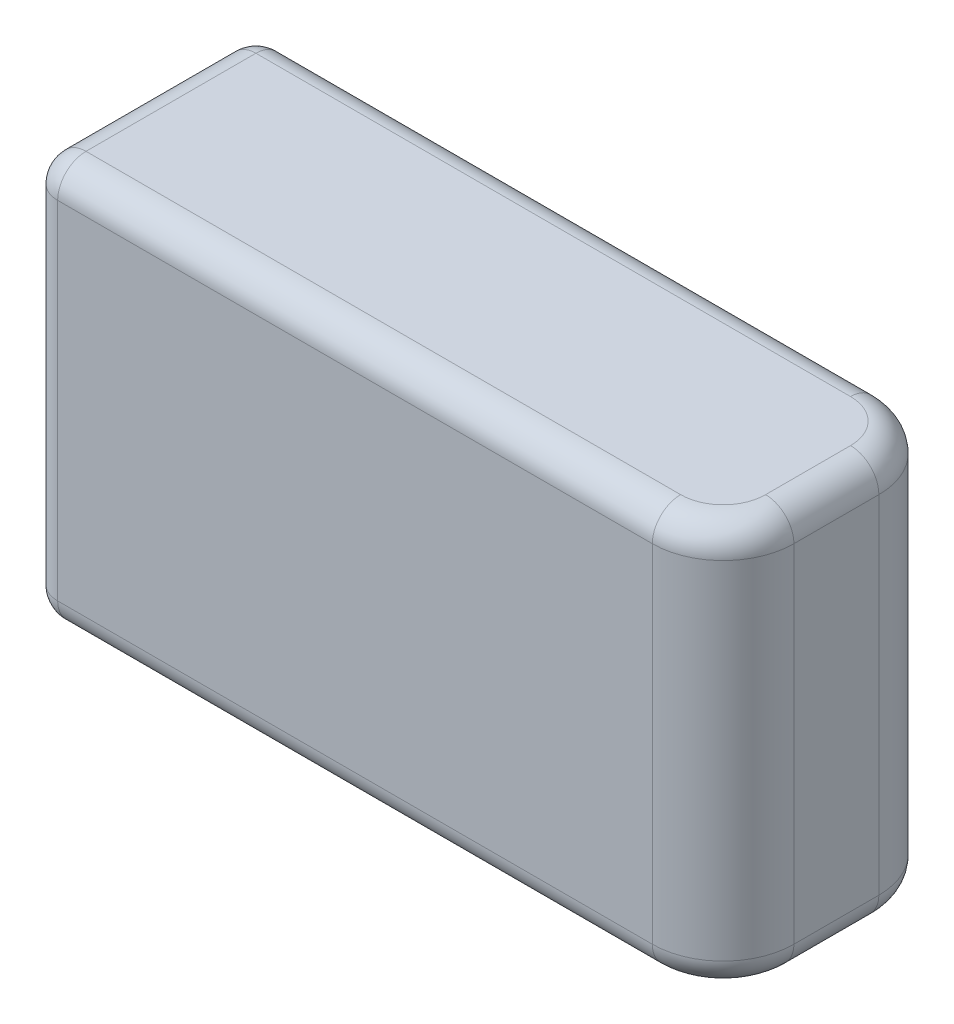
ISO-10303-21;
HEADER;
FILE_DESCRIPTION(('STEP AP214'),'2;1');
FILE_NAME('part.step','',(''),(''),'','','');
FILE_SCHEMA(('AUTOMOTIVE_DESIGN { 1 0 10303 214 1 1 1 1 }'));
ENDSEC;
DATA;
#1=APPLICATION_CONTEXT('core data for automotive mechanical design processes');
#2=APPLICATION_PROTOCOL_DEFINITION('international standard','automotive_design',2000,#1);
#3=PRODUCT_CONTEXT('',#1,'mechanical');
#4=PRODUCT('Part','Part','',(#3));
#5=PRODUCT_RELATED_PRODUCT_CATEGORY('part','',(#4));
#6=PRODUCT_DEFINITION_FORMATION('','',#4);
#7=PRODUCT_DEFINITION_CONTEXT('part definition',#1,'design');
#8=PRODUCT_DEFINITION('design','',#6,#7);
#9=PRODUCT_DEFINITION_SHAPE('','',#8);
#10=(LENGTH_UNIT() NAMED_UNIT(*) SI_UNIT(.MILLI.,.METRE.));
#11=(NAMED_UNIT(*) PLANE_ANGLE_UNIT() SI_UNIT($,.RADIAN.));
#12=(NAMED_UNIT(*) SI_UNIT($,.STERADIAN.) SOLID_ANGLE_UNIT());
#13=UNCERTAINTY_MEASURE_WITH_UNIT(LENGTH_MEASURE(1.E-05),#10,'distance_accuracy_value','');
#14=(GEOMETRIC_REPRESENTATION_CONTEXT(3) GLOBAL_UNCERTAINTY_ASSIGNED_CONTEXT((#13)) GLOBAL_UNIT_ASSIGNED_CONTEXT((#10,
#11,#12)) REPRESENTATION_CONTEXT('',''));
#15=CARTESIAN_POINT('',(0.,0.,0.));
#16=DIRECTION('',(0.,0.,1.));
#17=DIRECTION('',(1.,0.,0.));
#18=AXIS2_PLACEMENT_3D('',#15,#16,#17);
#19=CARTESIAN_POINT('',(0.,14.25,16.));
#20=DIRECTION('',(0.,1.,0.));
#21=DIRECTION('',(0.,0.,1.));
#22=AXIS2_PLACEMENT_3D('',#19,#20,#21);
#23=PLANE('',#22);
#24=DIRECTION('',(0.,0.,-1.));
#25=VECTOR('',#24,1.);
#26=CARTESIAN_POINT('',(-22.5,14.25,16.));
#27=LINE('',#26,#25);
#28=CARTESIAN_POINT('',(-22.5,14.25,2.));
#29=VERTEX_POINT('',#28);
#30=CARTESIAN_POINT('',(-22.5,14.25,14.));
#31=VERTEX_POINT('',#30);
#32=EDGE_CURVE('E207',#29,#31,#27,.F.);
#33=ORIENTED_EDGE('',*,*,#32,.T.);
#34=DIRECTION('',(1.,0.,0.));
#35=VECTOR('',#34,1.);
#36=CARTESIAN_POINT('',(0.,14.25,14.));
#37=LINE('',#36,#35);
#38=CARTESIAN_POINT('',(19.5,14.25,14.));
#39=VERTEX_POINT('',#38);
#40=EDGE_CURVE('E215',#31,#39,#37,.T.);
#41=ORIENTED_EDGE('',*,*,#40,.T.);
#42=CARTESIAN_POINT('',(19.5,14.25,11.));
#43=DIRECTION('',(0.,1.,0.));
#44=DIRECTION('',(0.,0.,1.));
#45=AXIS2_PLACEMENT_3D('',#42,#43,#44);
#46=CIRCLE('',#45,3.);
#47=CARTESIAN_POINT('',(22.5,14.25,11.));
#48=VERTEX_POINT('',#47);
#49=EDGE_CURVE('E213',#39,#48,#46,.T.);
#50=ORIENTED_EDGE('',*,*,#49,.T.);
#51=DIRECTION('',(0.,0.,-1.));
#52=VECTOR('',#51,1.);
#53=CARTESIAN_POINT('',(22.5,14.25,16.));
#54=LINE('',#53,#52);
#55=CARTESIAN_POINT('',(22.5,14.25,5.));
#56=VERTEX_POINT('',#55);
#57=EDGE_CURVE('E211',#48,#56,#54,.T.);
#58=ORIENTED_EDGE('',*,*,#57,.T.);
#59=CARTESIAN_POINT('',(19.5,14.25,5.));
#60=DIRECTION('',(0.,1.,0.));
#61=DIRECTION('',(0.,0.,1.));
#62=AXIS2_PLACEMENT_3D('',#59,#60,#61);
#63=CIRCLE('',#62,3.);
#64=CARTESIAN_POINT('',(19.5,14.25,2.));
#65=VERTEX_POINT('',#64);
#66=EDGE_CURVE('E209',#56,#65,#63,.T.);
#67=ORIENTED_EDGE('',*,*,#66,.T.);
#68=DIRECTION('',(1.,0.,0.));
#69=VECTOR('',#68,1.);
#70=CARTESIAN_POINT('',(-24.5,14.25,2.));
#71=LINE('',#70,#69);
#72=EDGE_CURVE('E205',#65,#29,#71,.F.);
#73=ORIENTED_EDGE('',*,*,#72,.T.);
#74=EDGE_LOOP('',(#33,#41,#50,#58,#67,#73));
#75=FACE_BOUND('',#74,.T.);
#76=ADVANCED_FACE('F41',(#75),#23,.T.);
#77=CARTESIAN_POINT('',(-24.5,0.,16.));
#78=DIRECTION('',(1.,0.,0.));
#79=DIRECTION('',(0.,0.,-1.));
#80=AXIS2_PLACEMENT_3D('',#77,#78,#79);
#81=PLANE('',#80);
#82=DIRECTION('',(0.,-1.,0.));
#83=VECTOR('',#82,1.);
#84=CARTESIAN_POINT('',(-24.5,14.25,14.));
#85=LINE('',#84,#83);
#86=CARTESIAN_POINT('',(-24.5,-12.25,14.));
#87=VERTEX_POINT('',#86);
#88=CARTESIAN_POINT('',(-24.5,12.25,14.));
#89=VERTEX_POINT('',#88);
#90=EDGE_CURVE('E222',#87,#89,#85,.F.);
#91=ORIENTED_EDGE('',*,*,#90,.T.);
#92=DIRECTION('',(0.,0.,-1.));
#93=VECTOR('',#92,1.);
#94=CARTESIAN_POINT('',(-24.5,12.25,0.));
#95=LINE('',#94,#93);
#96=CARTESIAN_POINT('',(-24.5,12.25,2.));
#97=VERTEX_POINT('',#96);
#98=EDGE_CURVE('E224',#89,#97,#95,.T.);
#99=ORIENTED_EDGE('',*,*,#98,.T.);
#100=DIRECTION('',(0.,-1.,0.));
#101=VECTOR('',#100,1.);
#102=CARTESIAN_POINT('',(-24.5,0.,2.));
#103=LINE('',#102,#101);
#104=CARTESIAN_POINT('',(-24.5,-12.25,2.));
#105=VERTEX_POINT('',#104);
#106=EDGE_CURVE('E218',#97,#105,#103,.T.);
#107=ORIENTED_EDGE('',*,*,#106,.T.);
#108=DIRECTION('',(0.,0.,-1.));
#109=VECTOR('',#108,1.);
#110=CARTESIAN_POINT('',(-24.5,-12.25,16.));
#111=LINE('',#110,#109);
#112=EDGE_CURVE('E220',#105,#87,#111,.F.);
#113=ORIENTED_EDGE('',*,*,#112,.T.);
#114=EDGE_LOOP('',(#91,#99,#107,#113));
#115=FACE_BOUND('',#114,.T.);
#116=ADVANCED_FACE('F353',(#115),#81,.F.);
#117=CARTESIAN_POINT('',(0.,-14.25,16.));
#118=DIRECTION('',(0.,1.,0.));
#119=DIRECTION('',(0.,0.,1.));
#120=AXIS2_PLACEMENT_3D('',#117,#118,#119);
#121=PLANE('',#120);
#122=CARTESIAN_POINT('',(19.5,-14.25,11.));
#123=DIRECTION('',(0.,1.,0.));
#124=DIRECTION('',(0.,0.,1.));
#125=AXIS2_PLACEMENT_3D('',#122,#123,#124);
#126=CIRCLE('',#125,3.);
#127=CARTESIAN_POINT('',(22.5,-14.25,11.));
#128=VERTEX_POINT('',#127);
#129=CARTESIAN_POINT('',(19.5,-14.25,14.));
#130=VERTEX_POINT('',#129);
#131=EDGE_CURVE('E194',#128,#130,#126,.F.);
#132=ORIENTED_EDGE('',*,*,#131,.T.);
#133=DIRECTION('',(1.,0.,0.));
#134=VECTOR('',#133,1.);
#135=CARTESIAN_POINT('',(-24.5,-14.25,14.));
#136=LINE('',#135,#134);
#137=CARTESIAN_POINT('',(-22.5,-14.25,14.));
#138=VERTEX_POINT('',#137);
#139=EDGE_CURVE('E147',#130,#138,#136,.F.);
#140=ORIENTED_EDGE('',*,*,#139,.T.);
#141=DIRECTION('',(0.,0.,-1.));
#142=VECTOR('',#141,1.);
#143=CARTESIAN_POINT('',(-22.5,-14.25,16.));
#144=LINE('',#143,#142);
#145=CARTESIAN_POINT('',(-22.5,-14.25,2.));
#146=VERTEX_POINT('',#145);
#147=EDGE_CURVE('E188',#138,#146,#144,.T.);
#148=ORIENTED_EDGE('',*,*,#147,.T.);
#149=DIRECTION('',(1.,0.,0.));
#150=VECTOR('',#149,1.);
#151=CARTESIAN_POINT('',(0.,-14.25,2.));
#152=LINE('',#151,#150);
#153=CARTESIAN_POINT('',(19.5,-14.25,2.));
#154=VERTEX_POINT('',#153);
#155=EDGE_CURVE('E172',#146,#154,#152,.T.);
#156=ORIENTED_EDGE('',*,*,#155,.T.);
#157=CARTESIAN_POINT('',(19.5,-14.25,5.));
#158=DIRECTION('',(0.,1.,0.));
#159=DIRECTION('',(0.,0.,1.));
#160=AXIS2_PLACEMENT_3D('',#157,#158,#159);
#161=CIRCLE('',#160,3.);
#162=CARTESIAN_POINT('',(22.5,-14.25,5.));
#163=VERTEX_POINT('',#162);
#164=EDGE_CURVE('E190',#154,#163,#161,.F.);
#165=ORIENTED_EDGE('',*,*,#164,.T.);
#166=DIRECTION('',(0.,0.,-1.));
#167=VECTOR('',#166,1.);
#168=CARTESIAN_POINT('',(22.5,-14.25,11.));
#169=LINE('',#168,#167);
#170=EDGE_CURVE('E192',#163,#128,#169,.F.);
#171=ORIENTED_EDGE('',*,*,#170,.T.);
#172=EDGE_LOOP('',(#132,#140,#148,#156,#165,#171));
#173=FACE_BOUND('',#172,.T.);
#174=ADVANCED_FACE('F323',(#173),#121,.F.);
#175=CARTESIAN_POINT('',(24.5,0.,16.));
#176=DIRECTION('',(1.,0.,0.));
#177=DIRECTION('',(0.,0.,-1.));
#178=AXIS2_PLACEMENT_3D('',#175,#176,#177);
#179=PLANE('',#178);
#180=DIRECTION('',(0.,-1.,0.));
#181=VECTOR('',#180,1.);
#182=CARTESIAN_POINT('',(24.5,0.,11.));
#183=LINE('',#182,#181);
#184=CARTESIAN_POINT('',(24.5,12.25,11.));
#185=VERTEX_POINT('',#184);
#186=CARTESIAN_POINT('',(24.5,-12.25,11.));
#187=VERTEX_POINT('',#186);
#188=EDGE_CURVE('E178',#185,#187,#183,.T.);
#189=ORIENTED_EDGE('',*,*,#188,.T.);
#190=DIRECTION('',(0.,0.,-1.));
#191=VECTOR('',#190,1.);
#192=CARTESIAN_POINT('',(24.5,-12.25,5.));
#193=LINE('',#192,#191);
#194=CARTESIAN_POINT('',(24.5,-12.25,5.));
#195=VERTEX_POINT('',#194);
#196=EDGE_CURVE('E199',#187,#195,#193,.T.);
#197=ORIENTED_EDGE('',*,*,#196,.T.);
#198=DIRECTION('',(0.,-1.,0.));
#199=VECTOR('',#198,1.);
#200=CARTESIAN_POINT('',(24.5,14.25,5.));
#201=LINE('',#200,#199);
#202=CARTESIAN_POINT('',(24.5,12.25,5.));
#203=VERTEX_POINT('',#202);
#204=EDGE_CURVE('E181',#195,#203,#201,.F.);
#205=ORIENTED_EDGE('',*,*,#204,.T.);
#206=DIRECTION('',(0.,0.,-1.));
#207=VECTOR('',#206,1.);
#208=CARTESIAN_POINT('',(24.5,12.25,16.));
#209=LINE('',#208,#207);
#210=EDGE_CURVE('E161',#203,#185,#209,.F.);
#211=ORIENTED_EDGE('',*,*,#210,.T.);
#212=EDGE_LOOP('',(#189,#197,#205,#211));
#213=FACE_BOUND('',#212,.T.);
#214=ADVANCED_FACE('F288',(#213),#179,.T.);
#215=CARTESIAN_POINT('',(0.,0.,16.));
#216=DIRECTION('',(0.,0.,1.));
#217=DIRECTION('',(1.,0.,0.));
#218=AXIS2_PLACEMENT_3D('',#215,#216,#217);
#219=PLANE('',#218);
#220=DIRECTION('',(0.,-1.,0.));
#221=VECTOR('',#220,1.);
#222=CARTESIAN_POINT('',(-22.5,-14.25,16.));
#223=LINE('',#222,#221);
#224=CARTESIAN_POINT('',(-22.5,12.25,16.));
#225=VERTEX_POINT('',#224);
#226=CARTESIAN_POINT('',(-22.5,-12.25,16.));
#227=VERTEX_POINT('',#226);
#228=EDGE_CURVE('E170',#225,#227,#223,.T.);
#229=ORIENTED_EDGE('',*,*,#228,.T.);
#230=DIRECTION('',(1.,0.,0.));
#231=VECTOR('',#230,1.);
#232=CARTESIAN_POINT('',(19.5,-12.25,16.));
#233=LINE('',#232,#231);
#234=CARTESIAN_POINT('',(19.5,-12.25,16.));
#235=VERTEX_POINT('',#234);
#236=EDGE_CURVE('E145',#227,#235,#233,.T.);
#237=ORIENTED_EDGE('',*,*,#236,.T.);
#238=DIRECTION('',(0.,-1.,0.));
#239=VECTOR('',#238,1.);
#240=CARTESIAN_POINT('',(19.5,0.,16.));
#241=LINE('',#240,#239);
#242=CARTESIAN_POINT('',(19.5,12.25,16.));
#243=VERTEX_POINT('',#242);
#244=EDGE_CURVE('E167',#235,#243,#241,.F.);
#245=ORIENTED_EDGE('',*,*,#244,.T.);
#246=DIRECTION('',(1.,0.,0.));
#247=VECTOR('',#246,1.);
#248=CARTESIAN_POINT('',(0.,12.25,16.));
#249=LINE('',#248,#247);
#250=EDGE_CURVE('E173',#243,#225,#249,.F.);
#251=ORIENTED_EDGE('',*,*,#250,.T.);
#252=EDGE_LOOP('',(#229,#237,#245,#251));
#253=FACE_BOUND('',#252,.T.);
#254=ADVANCED_FACE('F166',(#253),#219,.T.);
#255=CARTESIAN_POINT('',(0.,0.,0.));
#256=DIRECTION('',(0.,0.,1.));
#257=DIRECTION('',(1.,0.,0.));
#258=AXIS2_PLACEMENT_3D('',#255,#256,#257);
#259=PLANE('',#258);
#260=DIRECTION('',(0.,-1.,0.));
#261=VECTOR('',#260,1.);
#262=CARTESIAN_POINT('',(19.5,-14.25,0.));
#263=LINE('',#262,#261);
#264=CARTESIAN_POINT('',(19.5,12.25,0.));
#265=VERTEX_POINT('',#264);
#266=CARTESIAN_POINT('',(19.5,-12.25,0.));
#267=VERTEX_POINT('',#266);
#268=EDGE_CURVE('E177',#265,#267,#263,.T.);
#269=ORIENTED_EDGE('',*,*,#268,.T.);
#270=DIRECTION('',(1.,0.,0.));
#271=VECTOR('',#270,1.);
#272=CARTESIAN_POINT('',(0.,-12.25,0.));
#273=LINE('',#272,#271);
#274=CARTESIAN_POINT('',(-22.5,-12.25,0.));
#275=VERTEX_POINT('',#274);
#276=EDGE_CURVE('E11',#267,#275,#273,.F.);
#277=ORIENTED_EDGE('',*,*,#276,.T.);
#278=DIRECTION('',(0.,-1.,0.));
#279=VECTOR('',#278,1.);
#280=CARTESIAN_POINT('',(-22.5,0.,0.));
#281=LINE('',#280,#279);
#282=CARTESIAN_POINT('',(-22.5,12.25,0.));
#283=VERTEX_POINT('',#282);
#284=EDGE_CURVE('E50',#275,#283,#281,.F.);
#285=ORIENTED_EDGE('',*,*,#284,.T.);
#286=DIRECTION('',(1.,0.,0.));
#287=VECTOR('',#286,1.);
#288=CARTESIAN_POINT('',(19.5,12.25,0.));
#289=LINE('',#288,#287);
#290=EDGE_CURVE('E227',#283,#265,#289,.T.);
#291=ORIENTED_EDGE('',*,*,#290,.T.);
#292=EDGE_LOOP('',(#269,#277,#285,#291));
#293=FACE_BOUND('',#292,.T.);
#294=ADVANCED_FACE('F334',(#293),#259,.F.);
#295=CARTESIAN_POINT('',(19.5,0.,11.));
#296=DIRECTION('',(0.,-1.,0.));
#297=DIRECTION('',(0.,0.,-1.));
#298=AXIS2_PLACEMENT_3D('',#295,#296,#297);
#299=CYLINDRICAL_SURFACE('',#298,5.);
#300=ORIENTED_EDGE('',*,*,#244,.F.);
#301=CARTESIAN_POINT('',(19.5,-12.25,11.));
#302=DIRECTION('',(0.,1.,0.));
#303=DIRECTION('',(0.,0.,1.));
#304=AXIS2_PLACEMENT_3D('',#301,#302,#303);
#305=CIRCLE('',#304,5.);
#306=EDGE_CURVE('E153',#235,#187,#305,.T.);
#307=ORIENTED_EDGE('',*,*,#306,.T.);
#308=ORIENTED_EDGE('',*,*,#188,.F.);
#309=CARTESIAN_POINT('',(19.5,12.25,11.));
#310=DIRECTION('',(0.,1.,0.));
#311=DIRECTION('',(0.,0.,1.));
#312=AXIS2_PLACEMENT_3D('',#309,#310,#311);
#313=CIRCLE('',#312,5.);
#314=EDGE_CURVE('E162',#185,#243,#313,.F.);
#315=ORIENTED_EDGE('',*,*,#314,.T.);
#316=EDGE_LOOP('',(#300,#307,#308,#315));
#317=FACE_BOUND('',#316,.T.);
#318=ADVANCED_FACE('F175',(#317),#299,.T.);
#319=CARTESIAN_POINT('',(19.5,0.,5.));
#320=DIRECTION('',(0.,1.,0.));
#321=DIRECTION('',(0.,0.,1.));
#322=AXIS2_PLACEMENT_3D('',#319,#320,#321);
#323=CYLINDRICAL_SURFACE('',#322,5.);
#324=ORIENTED_EDGE('',*,*,#204,.F.);
#325=CARTESIAN_POINT('',(19.5,-12.25,5.));
#326=DIRECTION('',(0.,1.,0.));
#327=DIRECTION('',(0.,0.,1.));
#328=AXIS2_PLACEMENT_3D('',#325,#326,#327);
#329=CIRCLE('',#328,5.);
#330=EDGE_CURVE('E203',#195,#267,#329,.T.);
#331=ORIENTED_EDGE('',*,*,#330,.T.);
#332=ORIENTED_EDGE('',*,*,#268,.F.);
#333=CARTESIAN_POINT('',(19.5,12.25,5.));
#334=DIRECTION('',(0.,1.,0.));
#335=DIRECTION('',(0.,0.,1.));
#336=AXIS2_PLACEMENT_3D('',#333,#334,#335);
#337=CIRCLE('',#336,5.);
#338=EDGE_CURVE('E201',#265,#203,#337,.F.);
#339=ORIENTED_EDGE('',*,*,#338,.T.);
#340=EDGE_LOOP('',(#324,#331,#332,#339));
#341=FACE_BOUND('',#340,.T.);
#342=ADVANCED_FACE('F333',(#341),#323,.T.);
#343=CARTESIAN_POINT('',(19.5,12.25,5.));
#344=DIRECTION('',(0.,1.,0.));
#345=DIRECTION('',(0.,0.,1.));
#346=AXIS2_PLACEMENT_3D('',#343,#344,#345);
#347=TOROIDAL_SURFACE('',#346,3.,2.);
#348=CARTESIAN_POINT('',(22.5,12.25,5.));
#349=DIRECTION('',(0.,0.,1.));
#350=DIRECTION('',(1.,0.,0.));
#351=AXIS2_PLACEMENT_3D('',#348,#349,#350);
#352=CIRCLE('',#351,2.);
#353=EDGE_CURVE('E275',#203,#56,#352,.T.);
#354=ORIENTED_EDGE('',*,*,#353,.F.);
#355=ORIENTED_EDGE('',*,*,#338,.F.);
#356=CARTESIAN_POINT('',(19.5,12.25,2.));
#357=DIRECTION('',(-1.,0.,0.));
#358=DIRECTION('',(0.,0.,1.));
#359=AXIS2_PLACEMENT_3D('',#356,#357,#358);
#360=CIRCLE('',#359,2.);
#361=EDGE_CURVE('E45',#65,#265,#360,.T.);
#362=ORIENTED_EDGE('',*,*,#361,.F.);
#363=ORIENTED_EDGE('',*,*,#66,.F.);
#364=EDGE_LOOP('',(#354,#355,#362,#363));
#365=FACE_BOUND('',#364,.T.);
#366=ADVANCED_FACE('F43',(#365),#347,.T.);
#367=CARTESIAN_POINT('',(0.,12.25,2.));
#368=DIRECTION('',(-1.,0.,0.));
#369=DIRECTION('',(0.,0.,1.));
#370=AXIS2_PLACEMENT_3D('',#367,#368,#369);
#371=CYLINDRICAL_SURFACE('',#370,2.);
#372=ORIENTED_EDGE('',*,*,#361,.T.);
#373=ORIENTED_EDGE('',*,*,#290,.F.);
#374=CARTESIAN_POINT('',(-22.5,12.25,2.));
#375=DIRECTION('',(-1.,0.,0.));
#376=DIRECTION('',(0.,0.,1.));
#377=AXIS2_PLACEMENT_3D('',#374,#375,#376);
#378=CIRCLE('',#377,2.);
#379=EDGE_CURVE('E273',#29,#283,#378,.T.);
#380=ORIENTED_EDGE('',*,*,#379,.F.);
#381=ORIENTED_EDGE('',*,*,#72,.F.);
#382=EDGE_LOOP('',(#372,#373,#380,#381));
#383=FACE_BOUND('',#382,.T.);
#384=ADVANCED_FACE('F400',(#383),#371,.T.);
#385=CARTESIAN_POINT('',(22.5,12.25,16.));
#386=DIRECTION('',(0.,0.,-1.));
#387=DIRECTION('',(-1.,0.,0.));
#388=AXIS2_PLACEMENT_3D('',#385,#386,#387);
#389=CYLINDRICAL_SURFACE('',#388,2.);
#390=ORIENTED_EDGE('',*,*,#353,.T.);
#391=ORIENTED_EDGE('',*,*,#57,.F.);
#392=CARTESIAN_POINT('',(22.5,12.25,11.));
#393=DIRECTION('',(0.,0.,1.));
#394=DIRECTION('',(1.,0.,0.));
#395=AXIS2_PLACEMENT_3D('',#392,#393,#394);
#396=CIRCLE('',#395,2.);
#397=EDGE_CURVE('E270',#185,#48,#396,.T.);
#398=ORIENTED_EDGE('',*,*,#397,.F.);
#399=ORIENTED_EDGE('',*,*,#210,.F.);
#400=EDGE_LOOP('',(#390,#391,#398,#399));
#401=FACE_BOUND('',#400,.T.);
#402=ADVANCED_FACE('F296',(#401),#389,.T.);
#403=CARTESIAN_POINT('',(-22.5,12.25,2.));
#404=DIRECTION('',(0.,0.,1.));
#405=DIRECTION('',(1.,0.,0.));
#406=AXIS2_PLACEMENT_3D('',#403,#404,#405);
#407=SPHERICAL_SURFACE('',#406,2.);
#408=CARTESIAN_POINT('',(-22.5,12.25,2.));
#409=DIRECTION('',(0.,0.,-1.));
#410=DIRECTION('',(-1.,0.,0.));
#411=AXIS2_PLACEMENT_3D('',#408,#409,#410);
#412=CIRCLE('',#411,2.);
#413=EDGE_CURVE('E264',#29,#97,#412,.F.);
#414=ORIENTED_EDGE('',*,*,#413,.F.);
#415=ORIENTED_EDGE('',*,*,#379,.T.);
#416=CARTESIAN_POINT('',(-22.5,12.25,2.));
#417=DIRECTION('',(0.,1.,0.));
#418=DIRECTION('',(0.,0.,1.));
#419=AXIS2_PLACEMENT_3D('',#416,#417,#418);
#420=CIRCLE('',#419,2.);
#421=EDGE_CURVE('E267',#97,#283,#420,.F.);
#422=ORIENTED_EDGE('',*,*,#421,.F.);
#423=EDGE_LOOP('',(#414,#415,#422));
#424=FACE_BOUND('',#423,.T.);
#425=ADVANCED_FACE('F346',(#424),#407,.T.);
#426=CARTESIAN_POINT('',(19.5,12.25,11.));
#427=DIRECTION('',(0.,1.,0.));
#428=DIRECTION('',(0.,0.,1.));
#429=AXIS2_PLACEMENT_3D('',#426,#427,#428);
#430=TOROIDAL_SURFACE('',#429,3.,2.);
#431=ORIENTED_EDGE('',*,*,#397,.T.);
#432=ORIENTED_EDGE('',*,*,#49,.F.);
#433=CARTESIAN_POINT('',(19.5,12.25,14.));
#434=DIRECTION('',(-1.,0.,0.));
#435=DIRECTION('',(0.,0.,1.));
#436=AXIS2_PLACEMENT_3D('',#433,#434,#435);
#437=CIRCLE('',#436,2.);
#438=EDGE_CURVE('E262',#243,#39,#437,.T.);
#439=ORIENTED_EDGE('',*,*,#438,.F.);
#440=ORIENTED_EDGE('',*,*,#314,.F.);
#441=EDGE_LOOP('',(#431,#432,#439,#440));
#442=FACE_BOUND('',#441,.T.);
#443=ADVANCED_FACE('F299',(#442),#430,.T.);
#444=CARTESIAN_POINT('',(-22.5,0.,2.));
#445=DIRECTION('',(0.,-1.,0.));
#446=DIRECTION('',(0.,0.,-1.));
#447=AXIS2_PLACEMENT_3D('',#444,#445,#446);
#448=CYLINDRICAL_SURFACE('',#447,2.);
#449=ORIENTED_EDGE('',*,*,#421,.T.);
#450=ORIENTED_EDGE('',*,*,#284,.F.);
#451=CARTESIAN_POINT('',(-22.5,-12.25,2.));
#452=DIRECTION('',(0.,-1.,0.));
#453=DIRECTION('',(0.,0.,-1.));
#454=AXIS2_PLACEMENT_3D('',#451,#452,#453);
#455=CIRCLE('',#454,2.);
#456=EDGE_CURVE('E256',#105,#275,#455,.T.);
#457=ORIENTED_EDGE('',*,*,#456,.F.);
#458=ORIENTED_EDGE('',*,*,#106,.F.);
#459=EDGE_LOOP('',(#449,#450,#457,#458));
#460=FACE_BOUND('',#459,.T.);
#461=ADVANCED_FACE('F342',(#460),#448,.T.);
#462=CARTESIAN_POINT('',(-22.5,12.25,16.));
#463=DIRECTION('',(0.,0.,1.));
#464=DIRECTION('',(1.,0.,0.));
#465=AXIS2_PLACEMENT_3D('',#462,#463,#464);
#466=CYLINDRICAL_SURFACE('',#465,2.);
#467=ORIENTED_EDGE('',*,*,#413,.T.);
#468=ORIENTED_EDGE('',*,*,#98,.F.);
#469=CARTESIAN_POINT('',(-22.5,12.25,14.));
#470=DIRECTION('',(0.,0.,1.));
#471=DIRECTION('',(1.,0.,0.));
#472=AXIS2_PLACEMENT_3D('',#469,#470,#471);
#473=CIRCLE('',#472,2.);
#474=EDGE_CURVE('E253',#31,#89,#473,.T.);
#475=ORIENTED_EDGE('',*,*,#474,.F.);
#476=ORIENTED_EDGE('',*,*,#32,.F.);
#477=EDGE_LOOP('',(#467,#468,#475,#476));
#478=FACE_BOUND('',#477,.T.);
#479=ADVANCED_FACE('F351',(#478),#466,.T.);
#480=CARTESIAN_POINT('',(0.,12.25,14.));
#481=DIRECTION('',(1.,0.,0.));
#482=DIRECTION('',(0.,0.,-1.));
#483=AXIS2_PLACEMENT_3D('',#480,#481,#482);
#484=CYLINDRICAL_SURFACE('',#483,2.);
#485=ORIENTED_EDGE('',*,*,#438,.T.);
#486=ORIENTED_EDGE('',*,*,#40,.F.);
#487=CARTESIAN_POINT('',(-22.5,12.25,14.));
#488=DIRECTION('',(-1.,0.,0.));
#489=DIRECTION('',(0.,0.,1.));
#490=AXIS2_PLACEMENT_3D('',#487,#488,#489);
#491=CIRCLE('',#490,2.);
#492=EDGE_CURVE('E250',#225,#31,#491,.T.);
#493=ORIENTED_EDGE('',*,*,#492,.F.);
#494=ORIENTED_EDGE('',*,*,#250,.F.);
#495=EDGE_LOOP('',(#485,#486,#493,#494));
#496=FACE_BOUND('',#495,.T.);
#497=ADVANCED_FACE('F304',(#496),#484,.T.);
#498=CARTESIAN_POINT('',(0.,-12.25,2.));
#499=DIRECTION('',(1.,0.,0.));
#500=DIRECTION('',(0.,0.,-1.));
#501=AXIS2_PLACEMENT_3D('',#498,#499,#500);
#502=CYLINDRICAL_SURFACE('',#501,2.);
#503=CARTESIAN_POINT('',(-22.5,-12.25,2.));
#504=DIRECTION('',(-1.,0.,0.));
#505=DIRECTION('',(0.,0.,1.));
#506=AXIS2_PLACEMENT_3D('',#503,#504,#505);
#507=CIRCLE('',#506,2.);
#508=EDGE_CURVE('E259',#275,#146,#507,.T.);
#509=ORIENTED_EDGE('',*,*,#508,.F.);
#510=ORIENTED_EDGE('',*,*,#276,.F.);
#511=CARTESIAN_POINT('',(19.5,-12.25,2.));
#512=DIRECTION('',(1.,0.,0.));
#513=DIRECTION('',(0.,0.,-1.));
#514=AXIS2_PLACEMENT_3D('',#511,#512,#513);
#515=CIRCLE('',#514,2.);
#516=EDGE_CURVE('E247',#154,#267,#515,.T.);
#517=ORIENTED_EDGE('',*,*,#516,.F.);
#518=ORIENTED_EDGE('',*,*,#155,.F.);
#519=EDGE_LOOP('',(#509,#510,#517,#518));
#520=FACE_BOUND('',#519,.T.);
#521=ADVANCED_FACE('F337',(#520),#502,.T.);
#522=CARTESIAN_POINT('',(-22.5,-12.25,2.));
#523=DIRECTION('',(0.,0.,1.));
#524=DIRECTION('',(1.,0.,0.));
#525=AXIS2_PLACEMENT_3D('',#522,#523,#524);
#526=SPHERICAL_SURFACE('',#525,2.);
#527=ORIENTED_EDGE('',*,*,#456,.T.);
#528=ORIENTED_EDGE('',*,*,#508,.T.);
#529=CARTESIAN_POINT('',(-22.5,-12.25,2.));
#530=DIRECTION('',(0.,0.,-1.));
#531=DIRECTION('',(-1.,0.,0.));
#532=AXIS2_PLACEMENT_3D('',#529,#530,#531);
#533=CIRCLE('',#532,2.);
#534=EDGE_CURVE('E244',#105,#146,#533,.F.);
#535=ORIENTED_EDGE('',*,*,#534,.F.);
#536=EDGE_LOOP('',(#527,#528,#535));
#537=FACE_BOUND('',#536,.T.);
#538=ADVANCED_FACE('F340',(#537),#526,.T.);
#539=CARTESIAN_POINT('',(-22.5,12.25,14.));
#540=DIRECTION('',(0.,0.,1.));
#541=DIRECTION('',(1.,0.,0.));
#542=AXIS2_PLACEMENT_3D('',#539,#540,#541);
#543=SPHERICAL_SURFACE('',#542,2.);
#544=ORIENTED_EDGE('',*,*,#492,.T.);
#545=ORIENTED_EDGE('',*,*,#474,.T.);
#546=CARTESIAN_POINT('',(-22.5,12.25,14.));
#547=DIRECTION('',(0.,1.,0.));
#548=DIRECTION('',(0.,0.,1.));
#549=AXIS2_PLACEMENT_3D('',#546,#547,#548);
#550=CIRCLE('',#549,2.);
#551=EDGE_CURVE('E241',#225,#89,#550,.F.);
#552=ORIENTED_EDGE('',*,*,#551,.F.);
#553=EDGE_LOOP('',(#544,#545,#552));
#554=FACE_BOUND('',#553,.T.);
#555=ADVANCED_FACE('F308',(#554),#543,.T.);
#556=CARTESIAN_POINT('',(19.5,-12.25,5.));
#557=DIRECTION('',(0.,1.,0.));
#558=DIRECTION('',(0.,0.,1.));
#559=AXIS2_PLACEMENT_3D('',#556,#557,#558);
#560=TOROIDAL_SURFACE('',#559,3.,2.);
#561=ORIENTED_EDGE('',*,*,#516,.T.);
#562=ORIENTED_EDGE('',*,*,#330,.F.);
#563=CARTESIAN_POINT('',(22.5,-12.25,5.));
#564=DIRECTION('',(0.,0.,1.));
#565=DIRECTION('',(1.,0.,0.));
#566=AXIS2_PLACEMENT_3D('',#563,#564,#565);
#567=CIRCLE('',#566,2.);
#568=EDGE_CURVE('E238',#163,#195,#567,.T.);
#569=ORIENTED_EDGE('',*,*,#568,.F.);
#570=ORIENTED_EDGE('',*,*,#164,.F.);
#571=EDGE_LOOP('',(#561,#562,#569,#570));
#572=FACE_BOUND('',#571,.T.);
#573=ADVANCED_FACE('F330',(#572),#560,.T.);
#574=CARTESIAN_POINT('',(-22.5,-12.25,16.));
#575=DIRECTION('',(0.,0.,-1.));
#576=DIRECTION('',(-1.,0.,0.));
#577=AXIS2_PLACEMENT_3D('',#574,#575,#576);
#578=CYLINDRICAL_SURFACE('',#577,2.);
#579=ORIENTED_EDGE('',*,*,#534,.T.);
#580=ORIENTED_EDGE('',*,*,#147,.F.);
#581=CARTESIAN_POINT('',(-22.5,-12.25,14.));
#582=DIRECTION('',(0.,0.,1.));
#583=DIRECTION('',(1.,0.,0.));
#584=AXIS2_PLACEMENT_3D('',#581,#582,#583);
#585=CIRCLE('',#584,2.);
#586=EDGE_CURVE('E235',#87,#138,#585,.T.);
#587=ORIENTED_EDGE('',*,*,#586,.F.);
#588=ORIENTED_EDGE('',*,*,#112,.F.);
#589=EDGE_LOOP('',(#579,#580,#587,#588));
#590=FACE_BOUND('',#589,.T.);
#591=ADVANCED_FACE('F319',(#590),#578,.T.);
#592=CARTESIAN_POINT('',(-22.5,0.,14.));
#593=DIRECTION('',(0.,1.,0.));
#594=DIRECTION('',(0.,0.,1.));
#595=AXIS2_PLACEMENT_3D('',#592,#593,#594);
#596=CYLINDRICAL_SURFACE('',#595,2.);
#597=ORIENTED_EDGE('',*,*,#551,.T.);
#598=ORIENTED_EDGE('',*,*,#90,.F.);
#599=CARTESIAN_POINT('',(-22.5,-12.25,14.));
#600=DIRECTION('',(0.,-1.,0.));
#601=DIRECTION('',(0.,0.,-1.));
#602=AXIS2_PLACEMENT_3D('',#599,#600,#601);
#603=CIRCLE('',#602,2.);
#604=EDGE_CURVE('E232',#227,#87,#603,.T.);
#605=ORIENTED_EDGE('',*,*,#604,.F.);
#606=ORIENTED_EDGE('',*,*,#228,.F.);
#607=EDGE_LOOP('',(#597,#598,#605,#606));
#608=FACE_BOUND('',#607,.T.);
#609=ADVANCED_FACE('F311',(#608),#596,.T.);
#610=CARTESIAN_POINT('',(22.5,-12.25,16.));
#611=DIRECTION('',(0.,0.,1.));
#612=DIRECTION('',(1.,0.,0.));
#613=AXIS2_PLACEMENT_3D('',#610,#611,#612);
#614=CYLINDRICAL_SURFACE('',#613,2.);
#615=ORIENTED_EDGE('',*,*,#568,.T.);
#616=ORIENTED_EDGE('',*,*,#196,.F.);
#617=CARTESIAN_POINT('',(22.5,-12.25,11.));
#618=DIRECTION('',(0.,0.,1.));
#619=DIRECTION('',(1.,0.,0.));
#620=AXIS2_PLACEMENT_3D('',#617,#618,#619);
#621=CIRCLE('',#620,2.);
#622=EDGE_CURVE('E156',#128,#187,#621,.T.);
#623=ORIENTED_EDGE('',*,*,#622,.F.);
#624=ORIENTED_EDGE('',*,*,#170,.F.);
#625=EDGE_LOOP('',(#615,#616,#623,#624));
#626=FACE_BOUND('',#625,.T.);
#627=ADVANCED_FACE('F328',(#626),#614,.T.);
#628=CARTESIAN_POINT('',(-22.5,-12.25,14.));
#629=DIRECTION('',(0.,0.,1.));
#630=DIRECTION('',(1.,0.,0.));
#631=AXIS2_PLACEMENT_3D('',#628,#629,#630);
#632=SPHERICAL_SURFACE('',#631,2.);
#633=ORIENTED_EDGE('',*,*,#604,.T.);
#634=ORIENTED_EDGE('',*,*,#586,.T.);
#635=CARTESIAN_POINT('',(-22.5,-12.25,14.));
#636=DIRECTION('',(-1.,0.,0.));
#637=DIRECTION('',(0.,0.,1.));
#638=AXIS2_PLACEMENT_3D('',#635,#636,#637);
#639=CIRCLE('',#638,2.);
#640=EDGE_CURVE('E150',#227,#138,#639,.F.);
#641=ORIENTED_EDGE('',*,*,#640,.F.);
#642=EDGE_LOOP('',(#633,#634,#641));
#643=FACE_BOUND('',#642,.T.);
#644=ADVANCED_FACE('F315',(#643),#632,.T.);
#645=CARTESIAN_POINT('',(19.5,-12.25,11.));
#646=DIRECTION('',(0.,1.,0.));
#647=DIRECTION('',(0.,0.,1.));
#648=AXIS2_PLACEMENT_3D('',#645,#646,#647);
#649=TOROIDAL_SURFACE('',#648,3.,2.);
#650=ORIENTED_EDGE('',*,*,#622,.T.);
#651=ORIENTED_EDGE('',*,*,#306,.F.);
#652=CARTESIAN_POINT('',(19.5,-12.25,14.));
#653=DIRECTION('',(-1.,0.,0.));
#654=DIRECTION('',(0.,0.,1.));
#655=AXIS2_PLACEMENT_3D('',#652,#653,#654);
#656=CIRCLE('',#655,2.);
#657=EDGE_CURVE('E141',#130,#235,#656,.T.);
#658=ORIENTED_EDGE('',*,*,#657,.F.);
#659=ORIENTED_EDGE('',*,*,#131,.F.);
#660=EDGE_LOOP('',(#650,#651,#658,#659));
#661=FACE_BOUND('',#660,.T.);
#662=ADVANCED_FACE('F154',(#661),#649,.T.);
#663=CARTESIAN_POINT('',(0.,-12.25,14.));
#664=DIRECTION('',(-1.,0.,0.));
#665=DIRECTION('',(0.,0.,1.));
#666=AXIS2_PLACEMENT_3D('',#663,#664,#665);
#667=CYLINDRICAL_SURFACE('',#666,2.);
#668=ORIENTED_EDGE('',*,*,#640,.T.);
#669=ORIENTED_EDGE('',*,*,#139,.F.);
#670=ORIENTED_EDGE('',*,*,#657,.T.);
#671=ORIENTED_EDGE('',*,*,#236,.F.);
#672=EDGE_LOOP('',(#668,#669,#670,#671));
#673=FACE_BOUND('',#672,.T.);
#674=ADVANCED_FACE('F143',(#673),#667,.T.);
#675=CLOSED_SHELL('',(#76,#116,#174,#214,#254,#294,#318,#342,#366,#384,#402,#425,#443,#461,#479,
#497,#521,#538,#555,#573,#591,#609,#627,#644,#662,#674));
#676=MANIFOLD_SOLID_BREP('B2',#675);
#677=ADVANCED_BREP_SHAPE_REPRESENTATION('',(#18,#676),#14);
#678=SHAPE_DEFINITION_REPRESENTATION(#9,#677);
ENDSEC;
END-ISO-10303-21;
